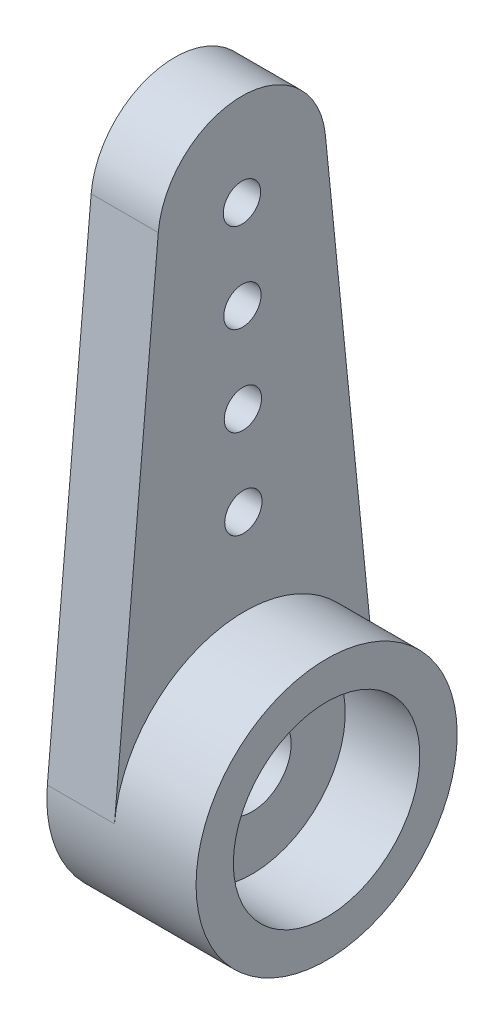
ISO-10303-21;
HEADER;
FILE_DESCRIPTION(('STEP AP214'),'2;1');
FILE_NAME('part.step','',(''),(''),'','','');
FILE_SCHEMA(('AUTOMOTIVE_DESIGN { 1 0 10303 214 1 1 1 1 }'));
ENDSEC;
DATA;
#1=APPLICATION_CONTEXT('core data for automotive mechanical design processes');
#2=APPLICATION_PROTOCOL_DEFINITION('international standard','automotive_design',2000,#1);
#3=PRODUCT_CONTEXT('',#1,'mechanical');
#4=PRODUCT('Part','Part','',(#3));
#5=PRODUCT_RELATED_PRODUCT_CATEGORY('part','',(#4));
#6=PRODUCT_DEFINITION_FORMATION('','',#4);
#7=PRODUCT_DEFINITION_CONTEXT('part definition',#1,'design');
#8=PRODUCT_DEFINITION('design','',#6,#7);
#9=PRODUCT_DEFINITION_SHAPE('','',#8);
#10=(LENGTH_UNIT() NAMED_UNIT(*) SI_UNIT(.MILLI.,.METRE.));
#11=(NAMED_UNIT(*) PLANE_ANGLE_UNIT() SI_UNIT($,.RADIAN.));
#12=(NAMED_UNIT(*) SI_UNIT($,.STERADIAN.) SOLID_ANGLE_UNIT());
#13=UNCERTAINTY_MEASURE_WITH_UNIT(LENGTH_MEASURE(1.E-05),#10,'distance_accuracy_value','');
#14=(GEOMETRIC_REPRESENTATION_CONTEXT(3) GLOBAL_UNCERTAINTY_ASSIGNED_CONTEXT((#13)) GLOBAL_UNIT_ASSIGNED_CONTEXT((#10,
#11,#12)) REPRESENTATION_CONTEXT('',''));
#15=CARTESIAN_POINT('',(0.,0.,0.));
#16=DIRECTION('',(0.,0.,1.));
#17=DIRECTION('',(1.,0.,0.));
#18=AXIS2_PLACEMENT_3D('',#15,#16,#17);
#19=CARTESIAN_POINT('',(4.,415.055894203775,585.534826128183));
#20=DIRECTION('',(-1.,0.,0.));
#21=DIRECTION('',(0.,0.,-1.));
#22=AXIS2_PLACEMENT_3D('',#19,#20,#21);
#23=CYLINDRICAL_SURFACE('',#22,1.04999999999998);
#24=CARTESIAN_POINT('',(0.,415.055894203775,585.534826128183));
#25=DIRECTION('',(-1.,0.,0.));
#26=DIRECTION('',(0.,0.,1.));
#27=AXIS2_PLACEMENT_3D('',#24,#25,#26);
#28=CIRCLE('',#27,1.04999999999998);
#29=CARTESIAN_POINT('',(0.,415.055894203775,586.584826128183));
#30=VERTEX_POINT('',#29);
#31=EDGE_CURVE('E100',#30,#30,#28,.T.);
#32=ORIENTED_EDGE('',*,*,#31,.T.);
#33=EDGE_LOOP('',(#32));
#34=FACE_BOUND('',#33,.T.);
#35=CARTESIAN_POINT('',(2.,415.055894203775,585.534826128183));
#36=DIRECTION('',(-1.,0.,0.));
#37=DIRECTION('',(0.,0.,1.));
#38=AXIS2_PLACEMENT_3D('',#35,#36,#37);
#39=CIRCLE('',#38,1.04999999999998);
#40=CARTESIAN_POINT('',(2.,415.055894203775,586.584826128183));
#41=VERTEX_POINT('',#40);
#42=EDGE_CURVE('E48',#41,#41,#39,.T.);
#43=ORIENTED_EDGE('',*,*,#42,.F.);
#44=EDGE_LOOP('',(#43));
#45=FACE_BOUND('',#44,.T.);
#46=ADVANCED_FACE('F45',(#34,#45),#23,.F.);
#47=CARTESIAN_POINT('',(4.,415.055894203775,585.534826128183));
#48=DIRECTION('',(-1.,0.,0.));
#49=DIRECTION('',(0.,0.,-1.));
#50=AXIS2_PLACEMENT_3D('',#47,#48,#49);
#51=CYLINDRICAL_SURFACE('',#50,3.49999999999997);
#52=CARTESIAN_POINT('',(1.8,415.055894203775,585.534826128183));
#53=DIRECTION('',(-1.,0.,0.));
#54=DIRECTION('',(0.,0.,1.));
#55=AXIS2_PLACEMENT_3D('',#52,#53,#54);
#56=CIRCLE('',#55,3.49999999999997);
#57=CARTESIAN_POINT('',(1.8,415.367382833466,589.020937835167));
#58=VERTEX_POINT('',#57);
#59=CARTESIAN_POINT('',(1.8,415.404762319808,582.052256525487));
#60=VERTEX_POINT('',#59);
#61=EDGE_CURVE('E91',#58,#60,#56,.T.);
#62=ORIENTED_EDGE('',*,*,#61,.F.);
#63=DIRECTION('',(-1.,0.,0.));
#64=VECTOR('',#63,1.);
#65=CARTESIAN_POINT('',(1.8,415.367382833466,589.020937835167));
#66=LINE('',#65,#64);
#67=CARTESIAN_POINT('',(0.,415.367382833466,589.020937835167));
#68=VERTEX_POINT('',#67);
#69=EDGE_CURVE('E134',#58,#68,#66,.T.);
#70=ORIENTED_EDGE('',*,*,#69,.T.);
#71=CARTESIAN_POINT('',(0.,415.055894203775,585.534826128183));
#72=DIRECTION('',(-1.,0.,0.));
#73=DIRECTION('',(0.,0.,1.));
#74=AXIS2_PLACEMENT_3D('',#71,#72,#73);
#75=CIRCLE('',#74,3.49999999999997);
#76=CARTESIAN_POINT('',(0.,415.404762319808,582.052256525487));
#77=VERTEX_POINT('',#76);
#78=EDGE_CURVE('E53',#77,#68,#75,.T.);
#79=ORIENTED_EDGE('',*,*,#78,.F.);
#80=DIRECTION('',(-1.,0.,0.));
#81=VECTOR('',#80,1.);
#82=CARTESIAN_POINT('',(1.8,415.404762319808,582.052256525487));
#83=LINE('',#82,#81);
#84=EDGE_CURVE('E101',#60,#77,#83,.T.);
#85=ORIENTED_EDGE('',*,*,#84,.F.);
#86=EDGE_LOOP('',(#62,#70,#79,#85));
#87=FACE_BOUND('',#86,.T.);
#88=CARTESIAN_POINT('',(4.,415.055894203775,585.534826128183));
#89=DIRECTION('',(-1.,0.,0.));
#90=DIRECTION('',(0.,0.,1.));
#91=AXIS2_PLACEMENT_3D('',#88,#89,#90);
#92=CIRCLE('',#91,3.49999999999997);
#93=CARTESIAN_POINT('',(4.,415.055894203775,589.034826128183));
#94=VERTEX_POINT('',#93);
#95=EDGE_CURVE('E11',#94,#94,#92,.T.);
#96=ORIENTED_EDGE('',*,*,#95,.T.);
#97=EDGE_LOOP('',(#96));
#98=FACE_BOUND('',#97,.T.);
#99=ADVANCED_FACE('F145',(#87,#98),#51,.T.);
#100=CARTESIAN_POINT('',(4.,0.,0.));
#101=DIRECTION('',(1.,0.,0.));
#102=DIRECTION('',(0.,0.,1.));
#103=AXIS2_PLACEMENT_3D('',#100,#101,#102);
#104=PLANE('',#103);
#105=CARTESIAN_POINT('',(4.,415.055894203775,585.534826128183));
#106=DIRECTION('',(-1.,0.,0.));
#107=DIRECTION('',(0.,0.,1.));
#108=AXIS2_PLACEMENT_3D('',#105,#106,#107);
#109=CIRCLE('',#108,2.49999999999992);
#110=CARTESIAN_POINT('',(4.,415.055894203775,588.034826128183));
#111=VERTEX_POINT('',#110);
#112=EDGE_CURVE('E176',#111,#111,#109,.T.);
#113=ORIENTED_EDGE('',*,*,#112,.T.);
#114=EDGE_LOOP('',(#113));
#115=FACE_BOUND('',#114,.T.);
#116=ORIENTED_EDGE('',*,*,#95,.F.);
#117=EDGE_LOOP('',(#116));
#118=FACE_BOUND('',#117,.T.);
#119=ADVANCED_FACE('F168',(#115,#118),#104,.T.);
#120=CARTESIAN_POINT('',(0.,0.,0.));
#121=DIRECTION('',(1.,0.,0.));
#122=DIRECTION('',(0.,0.,1.));
#123=AXIS2_PLACEMENT_3D('',#120,#121,#122);
#124=PLANE('',#123);
#125=ORIENTED_EDGE('',*,*,#31,.F.);
#126=EDGE_LOOP('',(#125));
#127=FACE_BOUND('',#126,.T.);
#128=ORIENTED_EDGE('',*,*,#78,.T.);
#129=DIRECTION('',(0.,0.996031916281233,-0.0889967513403472));
#130=VECTOR('',#129,1.);
#131=CARTESIAN_POINT('',(0.,55.5028240736758,621.175305710971));
#132=LINE('',#131,#130);
#133=CARTESIAN_POINT('',(0.,428.506169261749,587.846970124335));
#134=VERTEX_POINT('',#133);
#135=EDGE_CURVE('E129',#68,#134,#132,.T.);
#136=ORIENTED_EDGE('',*,*,#135,.T.);
#137=CARTESIAN_POINT('',(0.,428.305926571234,585.605898312703));
#138=DIRECTION('',(-1.,0.,0.));
#139=DIRECTION('',(0.,0.,1.));
#140=AXIS2_PLACEMENT_3D('',#137,#138,#139);
#141=CIRCLE('',#140,2.24999999999999);
#142=CARTESIAN_POINT('',(0.,428.53019893154,583.367103568113));
#143=VERTEX_POINT('',#142);
#144=EDGE_CURVE('E126',#143,#134,#141,.F.);
#145=ORIENTED_EDGE('',*,*,#144,.F.);
#146=DIRECTION('',(0.,0.995019886484311,0.0996766045807575));
#147=VECTOR('',#146,1.);
#148=CARTESIAN_POINT('',(0.,-53.6008383412623,535.069390717216));
#149=LINE('',#148,#147);
#150=EDGE_CURVE('E96',#77,#143,#149,.T.);
#151=ORIENTED_EDGE('',*,*,#150,.F.);
#152=EDGE_LOOP('',(#128,#136,#145,#151));
#153=FACE_BOUND('',#152,.T.);
#154=CARTESIAN_POINT('',(0.,420.881038800209,585.566071768958));
#155=DIRECTION('',(-1.,0.,0.));
#156=DIRECTION('',(0.,0.,1.));
#157=AXIS2_PLACEMENT_3D('',#154,#155,#156);
#158=CIRCLE('',#157,0.49999999999992);
#159=CARTESIAN_POINT('',(0.,420.881038800209,586.066071768958));
#160=VERTEX_POINT('',#159);
#161=EDGE_CURVE('E114',#160,#160,#158,.T.);
#162=ORIENTED_EDGE('',*,*,#161,.F.);
#163=EDGE_LOOP('',(#162));
#164=FACE_BOUND('',#163,.T.);
#165=CARTESIAN_POINT('',(0.,423.281038800209,585.578945189801));
#166=DIRECTION('',(-1.,0.,0.));
#167=DIRECTION('',(0.,0.,1.));
#168=AXIS2_PLACEMENT_3D('',#165,#166,#167);
#169=CIRCLE('',#168,0.49999999999992);
#170=CARTESIAN_POINT('',(0.,423.281038800209,586.078945189801));
#171=VERTEX_POINT('',#170);
#172=EDGE_CURVE('E117',#171,#171,#169,.T.);
#173=ORIENTED_EDGE('',*,*,#172,.F.);
#174=EDGE_LOOP('',(#173));
#175=FACE_BOUND('',#174,.T.);
#176=CARTESIAN_POINT('',(0.,425.681038800209,585.591818610644));
#177=DIRECTION('',(-1.,0.,0.));
#178=DIRECTION('',(0.,0.,1.));
#179=AXIS2_PLACEMENT_3D('',#176,#177,#178);
#180=CIRCLE('',#179,0.49999999999992);
#181=CARTESIAN_POINT('',(0.,425.681038800209,586.091818610643));
#182=VERTEX_POINT('',#181);
#183=EDGE_CURVE('E120',#182,#182,#180,.T.);
#184=ORIENTED_EDGE('',*,*,#183,.F.);
#185=EDGE_LOOP('',(#184));
#186=FACE_BOUND('',#185,.T.);
#187=CARTESIAN_POINT('',(0.,428.081038800209,585.604692031486));
#188=DIRECTION('',(-1.,0.,0.));
#189=DIRECTION('',(0.,0.,1.));
#190=AXIS2_PLACEMENT_3D('',#187,#188,#189);
#191=CIRCLE('',#190,0.49999999999992);
#192=CARTESIAN_POINT('',(0.,428.081038800209,586.104692031486));
#193=VERTEX_POINT('',#192);
#194=EDGE_CURVE('E123',#193,#193,#191,.T.);
#195=ORIENTED_EDGE('',*,*,#194,.F.);
#196=EDGE_LOOP('',(#195));
#197=FACE_BOUND('',#196,.T.);
#198=ADVANCED_FACE('F142',(#127,#153,#164,#175,#186,#197),#124,.F.);
#199=CARTESIAN_POINT('',(1.8,428.305926571234,585.605898312703));
#200=DIRECTION('',(-1.,0.,0.));
#201=DIRECTION('',(0.,0.,-1.));
#202=AXIS2_PLACEMENT_3D('',#199,#200,#201);
#203=CYLINDRICAL_SURFACE('',#202,2.24999999999999);
#204=ORIENTED_EDGE('',*,*,#144,.T.);
#205=DIRECTION('',(-1.,0.,0.));
#206=VECTOR('',#205,1.);
#207=CARTESIAN_POINT('',(1.8,428.506169261749,587.846970124335));
#208=LINE('',#207,#206);
#209=CARTESIAN_POINT('',(1.8,428.506169261749,587.846970124335));
#210=VERTEX_POINT('',#209);
#211=EDGE_CURVE('E104',#210,#134,#208,.T.);
#212=ORIENTED_EDGE('',*,*,#211,.F.);
#213=CARTESIAN_POINT('',(1.8,428.305926571234,585.605898312703));
#214=DIRECTION('',(-1.,0.,0.));
#215=DIRECTION('',(0.,0.,1.));
#216=AXIS2_PLACEMENT_3D('',#213,#214,#215);
#217=CIRCLE('',#216,2.24999999999999);
#218=CARTESIAN_POINT('',(1.8,428.53019893154,583.367103568113));
#219=VERTEX_POINT('',#218);
#220=EDGE_CURVE('E88',#219,#210,#217,.F.);
#221=ORIENTED_EDGE('',*,*,#220,.F.);
#222=DIRECTION('',(-1.,0.,0.));
#223=VECTOR('',#222,1.);
#224=CARTESIAN_POINT('',(1.8,428.53019893154,583.367103568113));
#225=LINE('',#224,#223);
#226=EDGE_CURVE('E94',#219,#143,#225,.T.);
#227=ORIENTED_EDGE('',*,*,#226,.T.);
#228=EDGE_LOOP('',(#204,#212,#221,#227));
#229=FACE_BOUND('',#228,.T.);
#230=ADVANCED_FACE('F103',(#229),#203,.T.);
#231=CARTESIAN_POINT('',(1.8,-53.6008383412623,535.069390717216));
#232=DIRECTION('',(0.,0.0996766045807575,-0.995019886484311));
#233=DIRECTION('',(0.,-0.995019886484311,-0.0996766045807575));
#234=AXIS2_PLACEMENT_3D('',#231,#232,#233);
#235=PLANE('',#234);
#236=ORIENTED_EDGE('',*,*,#150,.T.);
#237=ORIENTED_EDGE('',*,*,#226,.F.);
#238=DIRECTION('',(0.,0.995019886484311,0.0996766045807575));
#239=VECTOR('',#238,1.);
#240=CARTESIAN_POINT('',(1.8,-53.6008383412623,535.069390717216));
#241=LINE('',#240,#239);
#242=EDGE_CURVE('E61',#60,#219,#241,.T.);
#243=ORIENTED_EDGE('',*,*,#242,.F.);
#244=ORIENTED_EDGE('',*,*,#84,.T.);
#245=EDGE_LOOP('',(#236,#237,#243,#244));
#246=FACE_BOUND('',#245,.T.);
#247=ADVANCED_FACE('F95',(#246),#235,.T.);
#248=CARTESIAN_POINT('',(1.8,428.081038800209,585.604692031486));
#249=DIRECTION('',(-1.,0.,0.));
#250=DIRECTION('',(0.,0.,-1.));
#251=AXIS2_PLACEMENT_3D('',#248,#249,#250);
#252=CYLINDRICAL_SURFACE('',#251,0.49999999999992);
#253=CARTESIAN_POINT('',(1.8,428.081038800209,585.604692031486));
#254=DIRECTION('',(-1.,0.,0.));
#255=DIRECTION('',(0.,0.,1.));
#256=AXIS2_PLACEMENT_3D('',#253,#254,#255);
#257=CIRCLE('',#256,0.49999999999992);
#258=CARTESIAN_POINT('',(1.8,428.081038800209,586.104692031486));
#259=VERTEX_POINT('',#258);
#260=EDGE_CURVE('E105',#259,#259,#257,.T.);
#261=ORIENTED_EDGE('',*,*,#260,.F.);
#262=EDGE_LOOP('',(#261));
#263=FACE_BOUND('',#262,.T.);
#264=ORIENTED_EDGE('',*,*,#194,.T.);
#265=EDGE_LOOP('',(#264));
#266=FACE_BOUND('',#265,.T.);
#267=ADVANCED_FACE('F195',(#263,#266),#252,.F.);
#268=CARTESIAN_POINT('',(1.8,425.681038800209,585.591818610644));
#269=DIRECTION('',(-1.,0.,0.));
#270=DIRECTION('',(0.,0.,-1.));
#271=AXIS2_PLACEMENT_3D('',#268,#269,#270);
#272=CYLINDRICAL_SURFACE('',#271,0.49999999999992);
#273=CARTESIAN_POINT('',(1.8,425.681038800209,585.591818610644));
#274=DIRECTION('',(-1.,0.,0.));
#275=DIRECTION('',(0.,0.,1.));
#276=AXIS2_PLACEMENT_3D('',#273,#274,#275);
#277=CIRCLE('',#276,0.49999999999992);
#278=CARTESIAN_POINT('',(1.8,425.681038800209,586.091818610643));
#279=VERTEX_POINT('',#278);
#280=EDGE_CURVE('E108',#279,#279,#277,.T.);
#281=ORIENTED_EDGE('',*,*,#280,.F.);
#282=EDGE_LOOP('',(#281));
#283=FACE_BOUND('',#282,.T.);
#284=ORIENTED_EDGE('',*,*,#183,.T.);
#285=EDGE_LOOP('',(#284));
#286=FACE_BOUND('',#285,.T.);
#287=ADVANCED_FACE('F192',(#283,#286),#272,.F.);
#288=CARTESIAN_POINT('',(1.8,423.281038800209,585.578945189801));
#289=DIRECTION('',(-1.,0.,0.));
#290=DIRECTION('',(0.,0.,-1.));
#291=AXIS2_PLACEMENT_3D('',#288,#289,#290);
#292=CYLINDRICAL_SURFACE('',#291,0.49999999999992);
#293=CARTESIAN_POINT('',(1.8,423.281038800209,585.578945189801));
#294=DIRECTION('',(-1.,0.,0.));
#295=DIRECTION('',(0.,0.,1.));
#296=AXIS2_PLACEMENT_3D('',#293,#294,#295);
#297=CIRCLE('',#296,0.49999999999992);
#298=CARTESIAN_POINT('',(1.8,423.281038800209,586.078945189801));
#299=VERTEX_POINT('',#298);
#300=EDGE_CURVE('E185',#299,#299,#297,.T.);
#301=ORIENTED_EDGE('',*,*,#300,.F.);
#302=EDGE_LOOP('',(#301));
#303=FACE_BOUND('',#302,.T.);
#304=ORIENTED_EDGE('',*,*,#172,.T.);
#305=EDGE_LOOP('',(#304));
#306=FACE_BOUND('',#305,.T.);
#307=ADVANCED_FACE('F159',(#303,#306),#292,.F.);
#308=CARTESIAN_POINT('',(1.8,420.881038800209,585.566071768958));
#309=DIRECTION('',(-1.,0.,0.));
#310=DIRECTION('',(0.,0.,-1.));
#311=AXIS2_PLACEMENT_3D('',#308,#309,#310);
#312=CYLINDRICAL_SURFACE('',#311,0.49999999999992);
#313=CARTESIAN_POINT('',(1.8,420.881038800209,585.566071768958));
#314=DIRECTION('',(-1.,0.,0.));
#315=DIRECTION('',(0.,0.,1.));
#316=AXIS2_PLACEMENT_3D('',#313,#314,#315);
#317=CIRCLE('',#316,0.49999999999992);
#318=CARTESIAN_POINT('',(1.8,420.881038800209,586.066071768958));
#319=VERTEX_POINT('',#318);
#320=EDGE_CURVE('E132',#319,#319,#317,.T.);
#321=ORIENTED_EDGE('',*,*,#320,.F.);
#322=EDGE_LOOP('',(#321));
#323=FACE_BOUND('',#322,.T.);
#324=ORIENTED_EDGE('',*,*,#161,.T.);
#325=EDGE_LOOP('',(#324));
#326=FACE_BOUND('',#325,.T.);
#327=ADVANCED_FACE('F150',(#323,#326),#312,.F.);
#328=CARTESIAN_POINT('',(1.8,55.5028240736758,621.175305710971));
#329=DIRECTION('',(0.,-0.0889967513403472,-0.996031916281233));
#330=DIRECTION('',(0.,-0.996031916281233,0.0889967513403472));
#331=AXIS2_PLACEMENT_3D('',#328,#329,#330);
#332=PLANE('',#331);
#333=ORIENTED_EDGE('',*,*,#135,.F.);
#334=ORIENTED_EDGE('',*,*,#69,.F.);
#335=DIRECTION('',(0.,0.996031916281233,-0.0889967513403472));
#336=VECTOR('',#335,1.);
#337=CARTESIAN_POINT('',(1.8,55.5028240736758,621.175305710971));
#338=LINE('',#337,#336);
#339=EDGE_CURVE('E69',#58,#210,#338,.T.);
#340=ORIENTED_EDGE('',*,*,#339,.T.);
#341=ORIENTED_EDGE('',*,*,#211,.T.);
#342=EDGE_LOOP('',(#333,#334,#340,#341));
#343=FACE_BOUND('',#342,.T.);
#344=ADVANCED_FACE('F148',(#343),#332,.F.);
#345=CARTESIAN_POINT('',(1.8,0.,0.));
#346=DIRECTION('',(1.,0.,0.));
#347=DIRECTION('',(0.,0.,1.));
#348=AXIS2_PLACEMENT_3D('',#345,#346,#347);
#349=PLANE('',#348);
#350=ORIENTED_EDGE('',*,*,#320,.T.);
#351=EDGE_LOOP('',(#350));
#352=FACE_BOUND('',#351,.T.);
#353=ORIENTED_EDGE('',*,*,#300,.T.);
#354=EDGE_LOOP('',(#353));
#355=FACE_BOUND('',#354,.T.);
#356=ORIENTED_EDGE('',*,*,#280,.T.);
#357=EDGE_LOOP('',(#356));
#358=FACE_BOUND('',#357,.T.);
#359=ORIENTED_EDGE('',*,*,#260,.T.);
#360=EDGE_LOOP('',(#359));
#361=FACE_BOUND('',#360,.T.);
#362=ORIENTED_EDGE('',*,*,#220,.T.);
#363=ORIENTED_EDGE('',*,*,#339,.F.);
#364=ORIENTED_EDGE('',*,*,#61,.T.);
#365=ORIENTED_EDGE('',*,*,#242,.T.);
#366=EDGE_LOOP('',(#362,#363,#364,#365));
#367=FACE_BOUND('',#366,.T.);
#368=ADVANCED_FACE('F86',(#352,#355,#358,#361,#367),#349,.T.);
#369=CARTESIAN_POINT('',(2.,415.055894203775,585.534826128183));
#370=DIRECTION('',(1.,0.,0.));
#371=DIRECTION('',(0.,0.,1.));
#372=AXIS2_PLACEMENT_3D('',#369,#370,#371);
#373=CYLINDRICAL_SURFACE('',#372,2.49999999999992);
#374=CARTESIAN_POINT('',(2.,415.055894203775,585.534826128183));
#375=DIRECTION('',(-1.,0.,0.));
#376=DIRECTION('',(0.,0.,1.));
#377=AXIS2_PLACEMENT_3D('',#374,#375,#376);
#378=CIRCLE('',#377,2.49999999999992);
#379=CARTESIAN_POINT('',(2.,415.055894203775,588.034826128183));
#380=VERTEX_POINT('',#379);
#381=EDGE_CURVE('E174',#380,#380,#378,.T.);
#382=ORIENTED_EDGE('',*,*,#381,.T.);
#383=EDGE_LOOP('',(#382));
#384=FACE_BOUND('',#383,.T.);
#385=ORIENTED_EDGE('',*,*,#112,.F.);
#386=EDGE_LOOP('',(#385));
#387=FACE_BOUND('',#386,.T.);
#388=ADVANCED_FACE('F156',(#384,#387),#373,.F.);
#389=CARTESIAN_POINT('',(2.,415.055894203775,585.534826128183));
#390=DIRECTION('',(1.,0.,0.));
#391=DIRECTION('',(0.,0.,1.));
#392=AXIS2_PLACEMENT_3D('',#389,#390,#391);
#393=PLANE('',#392);
#394=ORIENTED_EDGE('',*,*,#42,.T.);
#395=EDGE_LOOP('',(#394));
#396=FACE_BOUND('',#395,.T.);
#397=ORIENTED_EDGE('',*,*,#381,.F.);
#398=EDGE_LOOP('',(#397));
#399=FACE_BOUND('',#398,.T.);
#400=ADVANCED_FACE('F226',(#396,#399),#393,.T.);
#401=CLOSED_SHELL('',(#46,#99,#119,#198,#230,#247,#267,#287,#307,#327,#344,#368,#388,#400));
#402=MANIFOLD_SOLID_BREP('B2',#401);
#403=ADVANCED_BREP_SHAPE_REPRESENTATION('',(#18,#402),#14);
#404=SHAPE_DEFINITION_REPRESENTATION(#9,#403);
ENDSEC;
END-ISO-10303-21;
